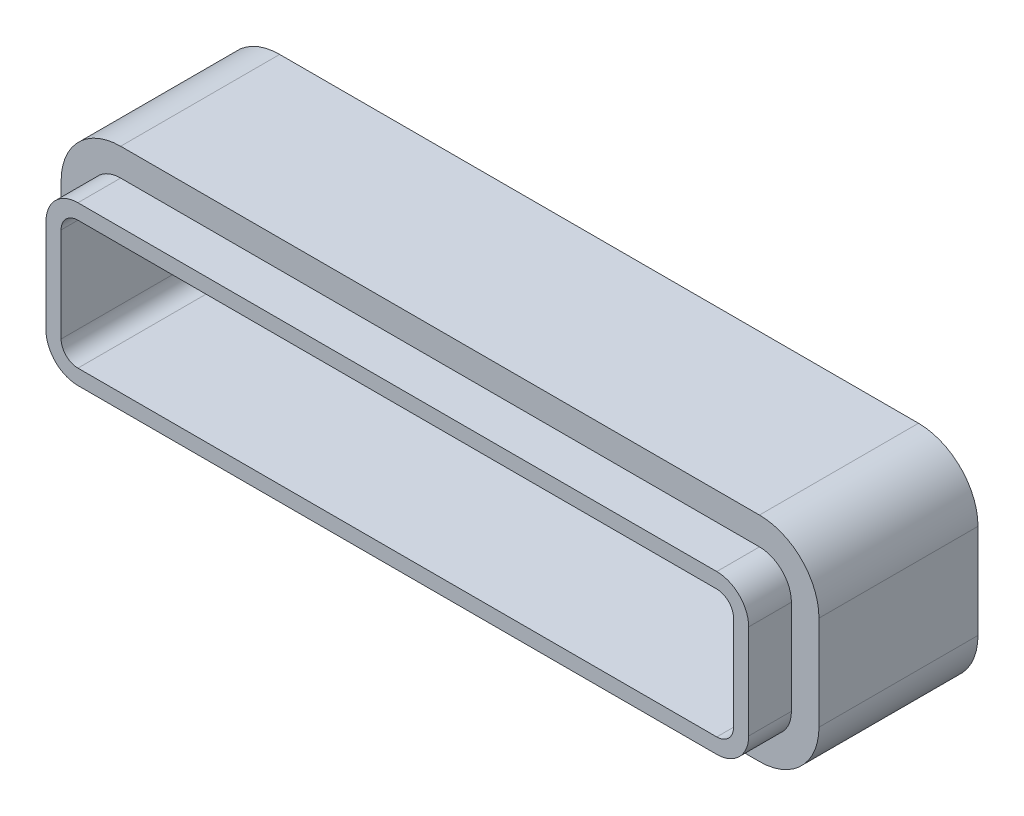
ISO-10303-21;
HEADER;
FILE_DESCRIPTION(('STEP AP214'),'2;1');
FILE_NAME('part.step','',(''),(''),'','','');
FILE_SCHEMA(('AUTOMOTIVE_DESIGN { 1 0 10303 214 1 1 1 1 }'));
ENDSEC;
DATA;
#1=APPLICATION_CONTEXT('core data for automotive mechanical design processes');
#2=APPLICATION_PROTOCOL_DEFINITION('international standard','automotive_design',2000,#1);
#3=PRODUCT_CONTEXT('',#1,'mechanical');
#4=PRODUCT('Part','Part','',(#3));
#5=PRODUCT_RELATED_PRODUCT_CATEGORY('part','',(#4));
#6=PRODUCT_DEFINITION_FORMATION('','',#4);
#7=PRODUCT_DEFINITION_CONTEXT('part definition',#1,'design');
#8=PRODUCT_DEFINITION('design','',#6,#7);
#9=PRODUCT_DEFINITION_SHAPE('','',#8);
#10=(LENGTH_UNIT() NAMED_UNIT(*) SI_UNIT(.MILLI.,.METRE.));
#11=(NAMED_UNIT(*) PLANE_ANGLE_UNIT() SI_UNIT($,.RADIAN.));
#12=(NAMED_UNIT(*) SI_UNIT($,.STERADIAN.) SOLID_ANGLE_UNIT());
#13=UNCERTAINTY_MEASURE_WITH_UNIT(LENGTH_MEASURE(1.E-05),#10,'distance_accuracy_value','');
#14=(GEOMETRIC_REPRESENTATION_CONTEXT(3) GLOBAL_UNCERTAINTY_ASSIGNED_CONTEXT((#13)) GLOBAL_UNIT_ASSIGNED_CONTEXT((#10,
#11,#12)) REPRESENTATION_CONTEXT('',''));
#15=CARTESIAN_POINT('',(0.,0.,0.));
#16=DIRECTION('',(0.,0.,1.));
#17=DIRECTION('',(1.,0.,0.));
#18=AXIS2_PLACEMENT_3D('',#15,#16,#17);
#19=CARTESIAN_POINT('',(95.,14.05,47.3));
#20=DIRECTION('',(0.,0.,-1.));
#21=DIRECTION('',(-1.,0.,0.));
#22=AXIS2_PLACEMENT_3D('',#19,#20,#21);
#23=PLANE('',#22);
#24=CARTESIAN_POINT('',(95.,14.05,47.3));
#25=DIRECTION('',(0.,0.,1.));
#26=DIRECTION('',(-1.,0.,0.));
#27=AXIS2_PLACEMENT_3D('',#24,#25,#26);
#28=CIRCLE('',#27,17.7);
#29=CARTESIAN_POINT('',(112.7,14.0499999999999,47.3));
#30=VERTEX_POINT('',#29);
#31=CARTESIAN_POINT('',(94.9999999999999,31.75,47.3));
#32=VERTEX_POINT('',#31);
#33=EDGE_CURVE('E332',#30,#32,#28,.T.);
#34=ORIENTED_EDGE('',*,*,#33,.T.);
#35=DIRECTION('',(-1.,0.,0.));
#36=VECTOR('',#35,1.);
#37=CARTESIAN_POINT('',(-94.9999999999999,31.75,47.3));
#38=LINE('',#37,#36);
#39=CARTESIAN_POINT('',(-94.9999999999999,31.75,47.3));
#40=VERTEX_POINT('',#39);
#41=EDGE_CURVE('E335',#32,#40,#38,.T.);
#42=ORIENTED_EDGE('',*,*,#41,.T.);
#43=CARTESIAN_POINT('',(-95.,14.05,47.3));
#44=DIRECTION('',(0.,0.,1.));
#45=DIRECTION('',(-1.,0.,0.));
#46=AXIS2_PLACEMENT_3D('',#43,#44,#45);
#47=CIRCLE('',#46,17.7);
#48=CARTESIAN_POINT('',(-112.7,14.0499999999999,47.3));
#49=VERTEX_POINT('',#48);
#50=EDGE_CURVE('E338',#40,#49,#47,.T.);
#51=ORIENTED_EDGE('',*,*,#50,.T.);
#52=DIRECTION('',(0.,-1.,0.));
#53=VECTOR('',#52,1.);
#54=CARTESIAN_POINT('',(-112.7,-14.0499999999999,47.3));
#55=LINE('',#54,#53);
#56=CARTESIAN_POINT('',(-112.7,-14.0499999999999,47.3));
#57=VERTEX_POINT('',#56);
#58=EDGE_CURVE('E340',#49,#57,#55,.T.);
#59=ORIENTED_EDGE('',*,*,#58,.T.);
#60=CARTESIAN_POINT('',(-95.,-14.05,47.3));
#61=DIRECTION('',(0.,0.,1.));
#62=DIRECTION('',(-1.,0.,0.));
#63=AXIS2_PLACEMENT_3D('',#60,#61,#62);
#64=CIRCLE('',#63,17.7);
#65=CARTESIAN_POINT('',(-94.9999999999999,-31.75,47.3));
#66=VERTEX_POINT('',#65);
#67=EDGE_CURVE('E342',#57,#66,#64,.T.);
#68=ORIENTED_EDGE('',*,*,#67,.T.);
#69=DIRECTION('',(1.,0.,0.));
#70=VECTOR('',#69,1.);
#71=CARTESIAN_POINT('',(-94.9999999999999,-31.75,47.3));
#72=LINE('',#71,#70);
#73=CARTESIAN_POINT('',(94.9999999999999,-31.75,47.3));
#74=VERTEX_POINT('',#73);
#75=EDGE_CURVE('E344',#66,#74,#72,.T.);
#76=ORIENTED_EDGE('',*,*,#75,.T.);
#77=CARTESIAN_POINT('',(95.,-14.05,47.3));
#78=DIRECTION('',(0.,0.,1.));
#79=DIRECTION('',(1.,0.,0.));
#80=AXIS2_PLACEMENT_3D('',#77,#78,#79);
#81=CIRCLE('',#80,17.7);
#82=CARTESIAN_POINT('',(112.7,-14.05,47.3));
#83=VERTEX_POINT('',#82);
#84=EDGE_CURVE('E346',#74,#83,#81,.T.);
#85=ORIENTED_EDGE('',*,*,#84,.T.);
#86=DIRECTION('',(0.,1.,0.));
#87=VECTOR('',#86,1.);
#88=CARTESIAN_POINT('',(112.7,-14.0499999999999,47.3));
#89=LINE('',#88,#87);
#90=EDGE_CURVE('E348',#83,#30,#89,.T.);
#91=ORIENTED_EDGE('',*,*,#90,.T.);
#92=EDGE_LOOP('',(#34,#42,#51,#59,#68,#76,#85,#91));
#93=FACE_BOUND('',#92,.T.);
#94=CARTESIAN_POINT('',(-94.9999999999999,14.05,47.3));
#95=DIRECTION('',(0.,0.,1.));
#96=DIRECTION('',(1.,0.,0.));
#97=AXIS2_PLACEMENT_3D('',#94,#95,#96);
#98=CIRCLE('',#97,9.50000000000001);
#99=CARTESIAN_POINT('',(-94.9999999999999,23.55,47.3));
#100=VERTEX_POINT('',#99);
#101=CARTESIAN_POINT('',(-104.5,14.05,47.3));
#102=VERTEX_POINT('',#101);
#103=EDGE_CURVE('E239',#100,#102,#98,.T.);
#104=ORIENTED_EDGE('',*,*,#103,.F.);
#105=DIRECTION('',(-1.,0.,0.));
#106=VECTOR('',#105,1.);
#107=CARTESIAN_POINT('',(95.,23.55,47.3));
#108=LINE('',#107,#106);
#109=CARTESIAN_POINT('',(95.,23.55,47.3));
#110=VERTEX_POINT('',#109);
#111=EDGE_CURVE('E244',#110,#100,#108,.T.);
#112=ORIENTED_EDGE('',*,*,#111,.F.);
#113=CARTESIAN_POINT('',(95.0000000000001,14.05,47.3));
#114=DIRECTION('',(0.,0.,1.));
#115=DIRECTION('',(1.,0.,0.));
#116=AXIS2_PLACEMENT_3D('',#113,#114,#115);
#117=CIRCLE('',#116,9.50000000000001);
#118=CARTESIAN_POINT('',(104.5,14.05,47.3));
#119=VERTEX_POINT('',#118);
#120=EDGE_CURVE('E272',#119,#110,#117,.T.);
#121=ORIENTED_EDGE('',*,*,#120,.F.);
#122=DIRECTION('',(0.,1.,0.));
#123=VECTOR('',#122,1.);
#124=CARTESIAN_POINT('',(104.5,-14.05,47.3));
#125=LINE('',#124,#123);
#126=CARTESIAN_POINT('',(104.5,-14.05,47.3));
#127=VERTEX_POINT('',#126);
#128=EDGE_CURVE('E269',#127,#119,#125,.T.);
#129=ORIENTED_EDGE('',*,*,#128,.F.);
#130=CARTESIAN_POINT('',(95.0000000000001,-14.05,47.3));
#131=DIRECTION('',(0.,0.,1.));
#132=DIRECTION('',(1.,0.,0.));
#133=AXIS2_PLACEMENT_3D('',#130,#131,#132);
#134=CIRCLE('',#133,9.50000000000001);
#135=CARTESIAN_POINT('',(95.,-23.55,47.3));
#136=VERTEX_POINT('',#135);
#137=EDGE_CURVE('E266',#136,#127,#134,.T.);
#138=ORIENTED_EDGE('',*,*,#137,.F.);
#139=DIRECTION('',(1.,0.,0.));
#140=VECTOR('',#139,1.);
#141=CARTESIAN_POINT('',(-94.9999999999999,-23.55,47.3));
#142=LINE('',#141,#140);
#143=CARTESIAN_POINT('',(-94.9999999999999,-23.55,47.3));
#144=VERTEX_POINT('',#143);
#145=EDGE_CURVE('E263',#144,#136,#142,.T.);
#146=ORIENTED_EDGE('',*,*,#145,.F.);
#147=CARTESIAN_POINT('',(-94.9999999999999,-14.05,47.3));
#148=DIRECTION('',(0.,0.,1.));
#149=DIRECTION('',(1.,0.,0.));
#150=AXIS2_PLACEMENT_3D('',#147,#148,#149);
#151=CIRCLE('',#150,9.50000000000001);
#152=CARTESIAN_POINT('',(-104.5,-14.05,47.3));
#153=VERTEX_POINT('',#152);
#154=EDGE_CURVE('E57',#153,#144,#151,.T.);
#155=ORIENTED_EDGE('',*,*,#154,.F.);
#156=DIRECTION('',(0.,-1.,0.));
#157=VECTOR('',#156,1.);
#158=CARTESIAN_POINT('',(-104.5,14.05,47.3));
#159=LINE('',#158,#157);
#160=EDGE_CURVE('E52',#102,#153,#159,.T.);
#161=ORIENTED_EDGE('',*,*,#160,.F.);
#162=EDGE_LOOP('',(#104,#112,#121,#129,#138,#146,#155,#161));
#163=FACE_BOUND('',#162,.T.);
#164=ADVANCED_FACE('F37',(#93,#163),#23,.F.);
#165=CARTESIAN_POINT('',(95.,14.05,0.));
#166=DIRECTION('',(0.,0.,-1.));
#167=DIRECTION('',(-1.,0.,0.));
#168=AXIS2_PLACEMENT_3D('',#165,#166,#167);
#169=PLANE('',#168);
#170=CARTESIAN_POINT('',(95.,14.05,0.));
#171=DIRECTION('',(0.,0.,1.));
#172=DIRECTION('',(-1.,0.,0.));
#173=AXIS2_PLACEMENT_3D('',#170,#171,#172);
#174=CIRCLE('',#173,17.7);
#175=CARTESIAN_POINT('',(112.7,14.0499999999999,0.));
#176=VERTEX_POINT('',#175);
#177=CARTESIAN_POINT('',(94.9999999999999,31.75,0.));
#178=VERTEX_POINT('',#177);
#179=EDGE_CURVE('E206',#176,#178,#174,.T.);
#180=ORIENTED_EDGE('',*,*,#179,.F.);
#181=DIRECTION('',(0.,1.,0.));
#182=VECTOR('',#181,1.);
#183=CARTESIAN_POINT('',(112.7,-14.0499999999999,0.));
#184=LINE('',#183,#182);
#185=CARTESIAN_POINT('',(112.7,-14.05,0.));
#186=VERTEX_POINT('',#185);
#187=EDGE_CURVE('E336',#186,#176,#184,.T.);
#188=ORIENTED_EDGE('',*,*,#187,.F.);
#189=CARTESIAN_POINT('',(95.,-14.05,0.));
#190=DIRECTION('',(0.,0.,1.));
#191=DIRECTION('',(1.,0.,0.));
#192=AXIS2_PLACEMENT_3D('',#189,#190,#191);
#193=CIRCLE('',#192,17.7);
#194=CARTESIAN_POINT('',(94.9999999999999,-31.75,0.));
#195=VERTEX_POINT('',#194);
#196=EDGE_CURVE('E363',#195,#186,#193,.T.);
#197=ORIENTED_EDGE('',*,*,#196,.F.);
#198=DIRECTION('',(1.,0.,0.));
#199=VECTOR('',#198,1.);
#200=CARTESIAN_POINT('',(-94.9999999999999,-31.75,0.));
#201=LINE('',#200,#199);
#202=CARTESIAN_POINT('',(-94.9999999999999,-31.75,0.));
#203=VERTEX_POINT('',#202);
#204=EDGE_CURVE('E361',#203,#195,#201,.T.);
#205=ORIENTED_EDGE('',*,*,#204,.F.);
#206=CARTESIAN_POINT('',(-95.,-14.05,0.));
#207=DIRECTION('',(0.,0.,1.));
#208=DIRECTION('',(-1.,0.,0.));
#209=AXIS2_PLACEMENT_3D('',#206,#207,#208);
#210=CIRCLE('',#209,17.7);
#211=CARTESIAN_POINT('',(-112.7,-14.0499999999999,0.));
#212=VERTEX_POINT('',#211);
#213=EDGE_CURVE('E359',#212,#203,#210,.T.);
#214=ORIENTED_EDGE('',*,*,#213,.F.);
#215=DIRECTION('',(0.,-1.,0.));
#216=VECTOR('',#215,1.);
#217=CARTESIAN_POINT('',(-112.7,-14.0499999999999,0.));
#218=LINE('',#217,#216);
#219=CARTESIAN_POINT('',(-112.7,14.0499999999999,0.));
#220=VERTEX_POINT('',#219);
#221=EDGE_CURVE('E357',#220,#212,#218,.T.);
#222=ORIENTED_EDGE('',*,*,#221,.F.);
#223=CARTESIAN_POINT('',(-95.,14.05,0.));
#224=DIRECTION('',(0.,0.,1.));
#225=DIRECTION('',(-1.,0.,0.));
#226=AXIS2_PLACEMENT_3D('',#223,#224,#225);
#227=CIRCLE('',#226,17.7);
#228=CARTESIAN_POINT('',(-94.9999999999999,31.75,0.));
#229=VERTEX_POINT('',#228);
#230=EDGE_CURVE('E355',#229,#220,#227,.T.);
#231=ORIENTED_EDGE('',*,*,#230,.F.);
#232=DIRECTION('',(-1.,0.,0.));
#233=VECTOR('',#232,1.);
#234=CARTESIAN_POINT('',(-94.9999999999999,31.75,0.));
#235=LINE('',#234,#233);
#236=EDGE_CURVE('E353',#178,#229,#235,.T.);
#237=ORIENTED_EDGE('',*,*,#236,.F.);
#238=EDGE_LOOP('',(#180,#188,#197,#205,#214,#222,#231,#237));
#239=FACE_BOUND('',#238,.T.);
#240=DIRECTION('',(0.,1.,0.));
#241=VECTOR('',#240,1.);
#242=CARTESIAN_POINT('',(100.,-14.05,0.));
#243=LINE('',#242,#241);
#244=CARTESIAN_POINT('',(100.,-14.05,0.));
#245=VERTEX_POINT('',#244);
#246=CARTESIAN_POINT('',(100.,14.05,0.));
#247=VERTEX_POINT('',#246);
#248=EDGE_CURVE('E317',#245,#247,#243,.T.);
#249=ORIENTED_EDGE('',*,*,#248,.T.);
#250=CARTESIAN_POINT('',(95.0000000000001,14.05,0.));
#251=DIRECTION('',(0.,0.,1.));
#252=DIRECTION('',(-1.,0.,0.));
#253=AXIS2_PLACEMENT_3D('',#250,#251,#252);
#254=CIRCLE('',#253,5.);
#255=CARTESIAN_POINT('',(95.,19.05,0.));
#256=VERTEX_POINT('',#255);
#257=EDGE_CURVE('E299',#247,#256,#254,.T.);
#258=ORIENTED_EDGE('',*,*,#257,.T.);
#259=DIRECTION('',(-1.,0.,0.));
#260=VECTOR('',#259,1.);
#261=CARTESIAN_POINT('',(-94.9999999999999,19.05,0.));
#262=LINE('',#261,#260);
#263=CARTESIAN_POINT('',(-94.9999999999999,19.05,0.));
#264=VERTEX_POINT('',#263);
#265=EDGE_CURVE('E203',#256,#264,#262,.T.);
#266=ORIENTED_EDGE('',*,*,#265,.T.);
#267=CARTESIAN_POINT('',(-94.9999999999999,14.05,0.));
#268=DIRECTION('',(0.,0.,1.));
#269=DIRECTION('',(-1.,0.,0.));
#270=AXIS2_PLACEMENT_3D('',#267,#268,#269);
#271=CIRCLE('',#270,5.);
#272=CARTESIAN_POINT('',(-99.9999999999999,14.05,0.));
#273=VERTEX_POINT('',#272);
#274=EDGE_CURVE('E302',#264,#273,#271,.T.);
#275=ORIENTED_EDGE('',*,*,#274,.T.);
#276=DIRECTION('',(0.,-1.,0.));
#277=VECTOR('',#276,1.);
#278=CARTESIAN_POINT('',(-99.9999999999999,-14.05,0.));
#279=LINE('',#278,#277);
#280=CARTESIAN_POINT('',(-99.9999999999999,-14.05,0.));
#281=VERTEX_POINT('',#280);
#282=EDGE_CURVE('E305',#273,#281,#279,.T.);
#283=ORIENTED_EDGE('',*,*,#282,.T.);
#284=CARTESIAN_POINT('',(-94.9999999999999,-14.05,0.));
#285=DIRECTION('',(0.,0.,1.));
#286=DIRECTION('',(-1.,0.,0.));
#287=AXIS2_PLACEMENT_3D('',#284,#285,#286);
#288=CIRCLE('',#287,5.);
#289=CARTESIAN_POINT('',(-94.9999999999999,-19.05,0.));
#290=VERTEX_POINT('',#289);
#291=EDGE_CURVE('E308',#281,#290,#288,.T.);
#292=ORIENTED_EDGE('',*,*,#291,.T.);
#293=DIRECTION('',(1.,0.,0.));
#294=VECTOR('',#293,1.);
#295=CARTESIAN_POINT('',(-94.9999999999999,-19.05,0.));
#296=LINE('',#295,#294);
#297=CARTESIAN_POINT('',(95.,-19.05,0.));
#298=VERTEX_POINT('',#297);
#299=EDGE_CURVE('E311',#290,#298,#296,.T.);
#300=ORIENTED_EDGE('',*,*,#299,.T.);
#301=CARTESIAN_POINT('',(95.0000000000001,-14.05,0.));
#302=DIRECTION('',(0.,0.,1.));
#303=DIRECTION('',(1.,0.,0.));
#304=AXIS2_PLACEMENT_3D('',#301,#302,#303);
#305=CIRCLE('',#304,5.);
#306=EDGE_CURVE('E314',#298,#245,#305,.T.);
#307=ORIENTED_EDGE('',*,*,#306,.T.);
#308=EDGE_LOOP('',(#249,#258,#266,#275,#283,#292,#300,#307));
#309=FACE_BOUND('',#308,.T.);
#310=ADVANCED_FACE('F393',(#239,#309),#169,.T.);
#311=CARTESIAN_POINT('',(95.,14.05,47.3));
#312=DIRECTION('',(0.,0.,-1.));
#313=DIRECTION('',(-1.,0.,0.));
#314=AXIS2_PLACEMENT_3D('',#311,#312,#313);
#315=CYLINDRICAL_SURFACE('',#314,17.7);
#316=ORIENTED_EDGE('',*,*,#179,.T.);
#317=DIRECTION('',(0.,0.,-1.));
#318=VECTOR('',#317,1.);
#319=CARTESIAN_POINT('',(94.9999999999999,31.75,47.3));
#320=LINE('',#319,#318);
#321=EDGE_CURVE('E11',#32,#178,#320,.T.);
#322=ORIENTED_EDGE('',*,*,#321,.F.);
#323=ORIENTED_EDGE('',*,*,#33,.F.);
#324=DIRECTION('',(0.,0.,-1.));
#325=VECTOR('',#324,1.);
#326=CARTESIAN_POINT('',(112.7,14.0499999999999,47.3));
#327=LINE('',#326,#325);
#328=EDGE_CURVE('E350',#30,#176,#327,.T.);
#329=ORIENTED_EDGE('',*,*,#328,.T.);
#330=EDGE_LOOP('',(#316,#322,#323,#329));
#331=FACE_BOUND('',#330,.T.);
#332=ADVANCED_FACE('F39',(#331),#315,.T.);
#333=CARTESIAN_POINT('',(-94.9999999999999,31.75,47.3));
#334=DIRECTION('',(0.,-1.,0.));
#335=DIRECTION('',(0.,0.,-1.));
#336=AXIS2_PLACEMENT_3D('',#333,#334,#335);
#337=PLANE('',#336);
#338=ORIENTED_EDGE('',*,*,#236,.T.);
#339=DIRECTION('',(0.,0.,-1.));
#340=VECTOR('',#339,1.);
#341=CARTESIAN_POINT('',(-94.9999999999999,31.75,47.3));
#342=LINE('',#341,#340);
#343=EDGE_CURVE('E45',#40,#229,#342,.T.);
#344=ORIENTED_EDGE('',*,*,#343,.F.);
#345=ORIENTED_EDGE('',*,*,#41,.F.);
#346=ORIENTED_EDGE('',*,*,#321,.T.);
#347=EDGE_LOOP('',(#338,#344,#345,#346));
#348=FACE_BOUND('',#347,.T.);
#349=ADVANCED_FACE('F410',(#348),#337,.F.);
#350=CARTESIAN_POINT('',(-95.,14.05,47.3));
#351=DIRECTION('',(0.,0.,-1.));
#352=DIRECTION('',(-1.,0.,0.));
#353=AXIS2_PLACEMENT_3D('',#350,#351,#352);
#354=CYLINDRICAL_SURFACE('',#353,17.7);
#355=ORIENTED_EDGE('',*,*,#230,.T.);
#356=DIRECTION('',(0.,0.,-1.));
#357=VECTOR('',#356,1.);
#358=CARTESIAN_POINT('',(-112.7,14.0499999999999,47.3));
#359=LINE('',#358,#357);
#360=EDGE_CURVE('E380',#49,#220,#359,.T.);
#361=ORIENTED_EDGE('',*,*,#360,.F.);
#362=ORIENTED_EDGE('',*,*,#50,.F.);
#363=ORIENTED_EDGE('',*,*,#343,.T.);
#364=EDGE_LOOP('',(#355,#361,#362,#363));
#365=FACE_BOUND('',#364,.T.);
#366=ADVANCED_FACE('F387',(#365),#354,.T.);
#367=CARTESIAN_POINT('',(-112.7,-14.0499999999999,47.3));
#368=DIRECTION('',(1.,0.,0.));
#369=DIRECTION('',(0.,0.,-1.));
#370=AXIS2_PLACEMENT_3D('',#367,#368,#369);
#371=PLANE('',#370);
#372=ORIENTED_EDGE('',*,*,#221,.T.);
#373=DIRECTION('',(0.,0.,-1.));
#374=VECTOR('',#373,1.);
#375=CARTESIAN_POINT('',(-112.7,-14.0499999999999,47.3));
#376=LINE('',#375,#374);
#377=EDGE_CURVE('E377',#57,#212,#376,.T.);
#378=ORIENTED_EDGE('',*,*,#377,.F.);
#379=ORIENTED_EDGE('',*,*,#58,.F.);
#380=ORIENTED_EDGE('',*,*,#360,.T.);
#381=EDGE_LOOP('',(#372,#378,#379,#380));
#382=FACE_BOUND('',#381,.T.);
#383=ADVANCED_FACE('F399',(#382),#371,.F.);
#384=CARTESIAN_POINT('',(-95.,-14.05,47.3));
#385=DIRECTION('',(0.,0.,-1.));
#386=DIRECTION('',(-1.,0.,0.));
#387=AXIS2_PLACEMENT_3D('',#384,#385,#386);
#388=CYLINDRICAL_SURFACE('',#387,17.7);
#389=ORIENTED_EDGE('',*,*,#213,.T.);
#390=DIRECTION('',(0.,0.,-1.));
#391=VECTOR('',#390,1.);
#392=CARTESIAN_POINT('',(-94.9999999999999,-31.75,47.3));
#393=LINE('',#392,#391);
#394=EDGE_CURVE('E374',#66,#203,#393,.T.);
#395=ORIENTED_EDGE('',*,*,#394,.F.);
#396=ORIENTED_EDGE('',*,*,#67,.F.);
#397=ORIENTED_EDGE('',*,*,#377,.T.);
#398=EDGE_LOOP('',(#389,#395,#396,#397));
#399=FACE_BOUND('',#398,.T.);
#400=ADVANCED_FACE('F403',(#399),#388,.T.);
#401=CARTESIAN_POINT('',(-94.9999999999999,-31.75,47.3));
#402=DIRECTION('',(0.,1.,0.));
#403=DIRECTION('',(0.,0.,1.));
#404=AXIS2_PLACEMENT_3D('',#401,#402,#403);
#405=PLANE('',#404);
#406=ORIENTED_EDGE('',*,*,#204,.T.);
#407=DIRECTION('',(0.,0.,-1.));
#408=VECTOR('',#407,1.);
#409=CARTESIAN_POINT('',(94.9999999999999,-31.75,47.3));
#410=LINE('',#409,#408);
#411=EDGE_CURVE('E371',#74,#195,#410,.T.);
#412=ORIENTED_EDGE('',*,*,#411,.F.);
#413=ORIENTED_EDGE('',*,*,#75,.F.);
#414=ORIENTED_EDGE('',*,*,#394,.T.);
#415=EDGE_LOOP('',(#406,#412,#413,#414));
#416=FACE_BOUND('',#415,.T.);
#417=ADVANCED_FACE('F423',(#416),#405,.F.);
#418=CARTESIAN_POINT('',(95.,-14.05,47.3));
#419=DIRECTION('',(0.,0.,-1.));
#420=DIRECTION('',(-1.,0.,0.));
#421=AXIS2_PLACEMENT_3D('',#418,#419,#420);
#422=CYLINDRICAL_SURFACE('',#421,17.7);
#423=ORIENTED_EDGE('',*,*,#196,.T.);
#424=DIRECTION('',(0.,0.,-1.));
#425=VECTOR('',#424,1.);
#426=CARTESIAN_POINT('',(112.7,-14.05,47.3));
#427=LINE('',#426,#425);
#428=EDGE_CURVE('E368',#83,#186,#427,.T.);
#429=ORIENTED_EDGE('',*,*,#428,.F.);
#430=ORIENTED_EDGE('',*,*,#84,.F.);
#431=ORIENTED_EDGE('',*,*,#411,.T.);
#432=EDGE_LOOP('',(#423,#429,#430,#431));
#433=FACE_BOUND('',#432,.T.);
#434=ADVANCED_FACE('F421',(#433),#422,.T.);
#435=CARTESIAN_POINT('',(112.7,-14.0499999999999,47.3));
#436=DIRECTION('',(-1.,0.,0.));
#437=DIRECTION('',(0.,0.,1.));
#438=AXIS2_PLACEMENT_3D('',#435,#436,#437);
#439=PLANE('',#438);
#440=ORIENTED_EDGE('',*,*,#187,.T.);
#441=ORIENTED_EDGE('',*,*,#328,.F.);
#442=ORIENTED_EDGE('',*,*,#90,.F.);
#443=ORIENTED_EDGE('',*,*,#428,.T.);
#444=EDGE_LOOP('',(#440,#441,#442,#443));
#445=FACE_BOUND('',#444,.T.);
#446=ADVANCED_FACE('F416',(#445),#439,.F.);
#447=CARTESIAN_POINT('',(95.0000000000001,14.05,47.3));
#448=DIRECTION('',(0.,0.,-1.));
#449=DIRECTION('',(-1.,0.,0.));
#450=AXIS2_PLACEMENT_3D('',#447,#448,#449);
#451=CYLINDRICAL_SURFACE('',#450,5.);
#452=ORIENTED_EDGE('',*,*,#257,.F.);
#453=DIRECTION('',(0.,0.,-1.));
#454=VECTOR('',#453,1.);
#455=CARTESIAN_POINT('',(100.,14.05,47.3));
#456=LINE('',#455,#454);
#457=CARTESIAN_POINT('',(100.,14.05,60.));
#458=VERTEX_POINT('',#457);
#459=EDGE_CURVE('E213',#458,#247,#456,.T.);
#460=ORIENTED_EDGE('',*,*,#459,.F.);
#461=CARTESIAN_POINT('',(95.0000000000001,14.05,60.));
#462=DIRECTION('',(0.,0.,1.));
#463=DIRECTION('',(1.,0.,0.));
#464=AXIS2_PLACEMENT_3D('',#461,#462,#463);
#465=CIRCLE('',#464,5.);
#466=CARTESIAN_POINT('',(95.,19.05,60.));
#467=VERTEX_POINT('',#466);
#468=EDGE_CURVE('E210',#458,#467,#465,.T.);
#469=ORIENTED_EDGE('',*,*,#468,.T.);
#470=DIRECTION('',(0.,0.,-1.));
#471=VECTOR('',#470,1.);
#472=CARTESIAN_POINT('',(95.,19.05,47.3));
#473=LINE('',#472,#471);
#474=EDGE_CURVE('E196',#467,#256,#473,.T.);
#475=ORIENTED_EDGE('',*,*,#474,.T.);
#476=EDGE_LOOP('',(#452,#460,#469,#475));
#477=FACE_BOUND('',#476,.T.);
#478=ADVANCED_FACE('F211',(#477),#451,.F.);
#479=CARTESIAN_POINT('',(-94.9999999999999,19.05,47.3));
#480=DIRECTION('',(0.,-1.,0.));
#481=DIRECTION('',(0.,0.,-1.));
#482=AXIS2_PLACEMENT_3D('',#479,#480,#481);
#483=PLANE('',#482);
#484=ORIENTED_EDGE('',*,*,#265,.F.);
#485=ORIENTED_EDGE('',*,*,#474,.F.);
#486=DIRECTION('',(-1.,0.,0.));
#487=VECTOR('',#486,1.);
#488=CARTESIAN_POINT('',(95.,19.05,60.));
#489=LINE('',#488,#487);
#490=CARTESIAN_POINT('',(-94.9999999999999,19.05,60.));
#491=VERTEX_POINT('',#490);
#492=EDGE_CURVE('E200',#467,#491,#489,.T.);
#493=ORIENTED_EDGE('',*,*,#492,.T.);
#494=DIRECTION('',(0.,0.,-1.));
#495=VECTOR('',#494,1.);
#496=CARTESIAN_POINT('',(-94.9999999999999,19.05,47.3));
#497=LINE('',#496,#495);
#498=EDGE_CURVE('E207',#491,#264,#497,.T.);
#499=ORIENTED_EDGE('',*,*,#498,.T.);
#500=EDGE_LOOP('',(#484,#485,#493,#499));
#501=FACE_BOUND('',#500,.T.);
#502=ADVANCED_FACE('F198',(#501),#483,.T.);
#503=CARTESIAN_POINT('',(-94.9999999999999,14.05,47.3));
#504=DIRECTION('',(0.,0.,-1.));
#505=DIRECTION('',(-1.,0.,0.));
#506=AXIS2_PLACEMENT_3D('',#503,#504,#505);
#507=CYLINDRICAL_SURFACE('',#506,5.);
#508=ORIENTED_EDGE('',*,*,#274,.F.);
#509=ORIENTED_EDGE('',*,*,#498,.F.);
#510=CARTESIAN_POINT('',(-94.9999999999999,14.05,60.));
#511=DIRECTION('',(0.,0.,1.));
#512=DIRECTION('',(1.,0.,0.));
#513=AXIS2_PLACEMENT_3D('',#510,#511,#512);
#514=CIRCLE('',#513,5.);
#515=CARTESIAN_POINT('',(-99.9999999999999,14.05,60.));
#516=VERTEX_POINT('',#515);
#517=EDGE_CURVE('E221',#491,#516,#514,.T.);
#518=ORIENTED_EDGE('',*,*,#517,.T.);
#519=DIRECTION('',(0.,0.,-1.));
#520=VECTOR('',#519,1.);
#521=CARTESIAN_POINT('',(-99.9999999999999,14.05,47.3));
#522=LINE('',#521,#520);
#523=EDGE_CURVE('E329',#516,#273,#522,.T.);
#524=ORIENTED_EDGE('',*,*,#523,.T.);
#525=EDGE_LOOP('',(#508,#509,#518,#524));
#526=FACE_BOUND('',#525,.T.);
#527=ADVANCED_FACE('F448',(#526),#507,.F.);
#528=CARTESIAN_POINT('',(-99.9999999999999,-14.05,47.3));
#529=DIRECTION('',(1.,0.,0.));
#530=DIRECTION('',(0.,0.,-1.));
#531=AXIS2_PLACEMENT_3D('',#528,#529,#530);
#532=PLANE('',#531);
#533=ORIENTED_EDGE('',*,*,#282,.F.);
#534=ORIENTED_EDGE('',*,*,#523,.F.);
#535=DIRECTION('',(0.,-1.,0.));
#536=VECTOR('',#535,1.);
#537=CARTESIAN_POINT('',(-99.9999999999999,14.05,60.));
#538=LINE('',#537,#536);
#539=CARTESIAN_POINT('',(-99.9999999999999,-14.05,60.));
#540=VERTEX_POINT('',#539);
#541=EDGE_CURVE('E223',#516,#540,#538,.T.);
#542=ORIENTED_EDGE('',*,*,#541,.T.);
#543=DIRECTION('',(0.,0.,-1.));
#544=VECTOR('',#543,1.);
#545=CARTESIAN_POINT('',(-99.9999999999999,-14.05,47.3));
#546=LINE('',#545,#544);
#547=EDGE_CURVE('E327',#540,#281,#546,.T.);
#548=ORIENTED_EDGE('',*,*,#547,.T.);
#549=EDGE_LOOP('',(#533,#534,#542,#548));
#550=FACE_BOUND('',#549,.T.);
#551=ADVANCED_FACE('F452',(#550),#532,.T.);
#552=CARTESIAN_POINT('',(-94.9999999999999,-14.05,47.3));
#553=DIRECTION('',(0.,0.,-1.));
#554=DIRECTION('',(-1.,0.,0.));
#555=AXIS2_PLACEMENT_3D('',#552,#553,#554);
#556=CYLINDRICAL_SURFACE('',#555,5.);
#557=ORIENTED_EDGE('',*,*,#291,.F.);
#558=ORIENTED_EDGE('',*,*,#547,.F.);
#559=CARTESIAN_POINT('',(-94.9999999999999,-14.05,60.));
#560=DIRECTION('',(0.,0.,1.));
#561=DIRECTION('',(1.,0.,0.));
#562=AXIS2_PLACEMENT_3D('',#559,#560,#561);
#563=CIRCLE('',#562,5.);
#564=CARTESIAN_POINT('',(-94.9999999999999,-19.05,60.));
#565=VERTEX_POINT('',#564);
#566=EDGE_CURVE('E228',#540,#565,#563,.T.);
#567=ORIENTED_EDGE('',*,*,#566,.T.);
#568=DIRECTION('',(0.,0.,-1.));
#569=VECTOR('',#568,1.);
#570=CARTESIAN_POINT('',(-94.9999999999999,-19.05,47.3));
#571=LINE('',#570,#569);
#572=EDGE_CURVE('E325',#565,#290,#571,.T.);
#573=ORIENTED_EDGE('',*,*,#572,.T.);
#574=EDGE_LOOP('',(#557,#558,#567,#573));
#575=FACE_BOUND('',#574,.T.);
#576=ADVANCED_FACE('F458',(#575),#556,.F.);
#577=CARTESIAN_POINT('',(-94.9999999999999,-19.05,47.3));
#578=DIRECTION('',(0.,1.,0.));
#579=DIRECTION('',(0.,0.,1.));
#580=AXIS2_PLACEMENT_3D('',#577,#578,#579);
#581=PLANE('',#580);
#582=ORIENTED_EDGE('',*,*,#299,.F.);
#583=ORIENTED_EDGE('',*,*,#572,.F.);
#584=DIRECTION('',(1.,0.,0.));
#585=VECTOR('',#584,1.);
#586=CARTESIAN_POINT('',(-94.9999999999999,-19.05,60.));
#587=LINE('',#586,#585);
#588=CARTESIAN_POINT('',(95.,-19.05,60.));
#589=VERTEX_POINT('',#588);
#590=EDGE_CURVE('E231',#565,#589,#587,.T.);
#591=ORIENTED_EDGE('',*,*,#590,.T.);
#592=DIRECTION('',(0.,0.,-1.));
#593=VECTOR('',#592,1.);
#594=CARTESIAN_POINT('',(95.,-19.05,47.3));
#595=LINE('',#594,#593);
#596=EDGE_CURVE('E323',#589,#298,#595,.T.);
#597=ORIENTED_EDGE('',*,*,#596,.T.);
#598=EDGE_LOOP('',(#582,#583,#591,#597));
#599=FACE_BOUND('',#598,.T.);
#600=ADVANCED_FACE('F462',(#599),#581,.T.);
#601=CARTESIAN_POINT('',(95.0000000000001,-14.05,47.3));
#602=DIRECTION('',(0.,0.,-1.));
#603=DIRECTION('',(-1.,0.,0.));
#604=AXIS2_PLACEMENT_3D('',#601,#602,#603);
#605=CYLINDRICAL_SURFACE('',#604,5.);
#606=ORIENTED_EDGE('',*,*,#306,.F.);
#607=ORIENTED_EDGE('',*,*,#596,.F.);
#608=CARTESIAN_POINT('',(95.0000000000001,-14.05,60.));
#609=DIRECTION('',(0.,0.,1.));
#610=DIRECTION('',(1.,0.,0.));
#611=AXIS2_PLACEMENT_3D('',#608,#609,#610);
#612=CIRCLE('',#611,5.);
#613=CARTESIAN_POINT('',(100.,-14.05,60.));
#614=VERTEX_POINT('',#613);
#615=EDGE_CURVE('E234',#589,#614,#612,.T.);
#616=ORIENTED_EDGE('',*,*,#615,.T.);
#617=DIRECTION('',(0.,0.,-1.));
#618=VECTOR('',#617,1.);
#619=CARTESIAN_POINT('',(100.,-14.05,47.3));
#620=LINE('',#619,#618);
#621=EDGE_CURVE('E321',#614,#245,#620,.T.);
#622=ORIENTED_EDGE('',*,*,#621,.T.);
#623=EDGE_LOOP('',(#606,#607,#616,#622));
#624=FACE_BOUND('',#623,.T.);
#625=ADVANCED_FACE('F466',(#624),#605,.F.);
#626=CARTESIAN_POINT('',(100.,-14.05,47.3));
#627=DIRECTION('',(-1.,0.,0.));
#628=DIRECTION('',(0.,0.,1.));
#629=AXIS2_PLACEMENT_3D('',#626,#627,#628);
#630=PLANE('',#629);
#631=ORIENTED_EDGE('',*,*,#248,.F.);
#632=ORIENTED_EDGE('',*,*,#621,.F.);
#633=DIRECTION('',(0.,1.,0.));
#634=VECTOR('',#633,1.);
#635=CARTESIAN_POINT('',(100.,-14.05,60.));
#636=LINE('',#635,#634);
#637=EDGE_CURVE('E237',#614,#458,#636,.T.);
#638=ORIENTED_EDGE('',*,*,#637,.T.);
#639=ORIENTED_EDGE('',*,*,#459,.T.);
#640=EDGE_LOOP('',(#631,#632,#638,#639));
#641=FACE_BOUND('',#640,.T.);
#642=ADVANCED_FACE('F470',(#641),#630,.T.);
#643=CARTESIAN_POINT('',(-94.9999999999999,14.05,60.));
#644=DIRECTION('',(0.,0.,1.));
#645=DIRECTION('',(1.,0.,0.));
#646=AXIS2_PLACEMENT_3D('',#643,#644,#645);
#647=PLANE('',#646);
#648=CARTESIAN_POINT('',(-94.9999999999999,14.05,60.));
#649=DIRECTION('',(0.,0.,1.));
#650=DIRECTION('',(1.,0.,0.));
#651=AXIS2_PLACEMENT_3D('',#648,#649,#650);
#652=CIRCLE('',#651,9.50000000000001);
#653=CARTESIAN_POINT('',(-94.9999999999999,23.55,60.));
#654=VERTEX_POINT('',#653);
#655=CARTESIAN_POINT('',(-104.5,14.05,60.));
#656=VERTEX_POINT('',#655);
#657=EDGE_CURVE('E240',#654,#656,#652,.T.);
#658=ORIENTED_EDGE('',*,*,#657,.T.);
#659=DIRECTION('',(0.,-1.,0.));
#660=VECTOR('',#659,1.);
#661=CARTESIAN_POINT('',(-104.5,14.05,60.));
#662=LINE('',#661,#660);
#663=CARTESIAN_POINT('',(-104.5,-14.05,60.));
#664=VERTEX_POINT('',#663);
#665=EDGE_CURVE('E243',#656,#664,#662,.T.);
#666=ORIENTED_EDGE('',*,*,#665,.T.);
#667=CARTESIAN_POINT('',(-94.9999999999999,-14.05,60.));
#668=DIRECTION('',(0.,0.,1.));
#669=DIRECTION('',(1.,0.,0.));
#670=AXIS2_PLACEMENT_3D('',#667,#668,#669);
#671=CIRCLE('',#670,9.50000000000001);
#672=CARTESIAN_POINT('',(-94.9999999999999,-23.55,60.));
#673=VERTEX_POINT('',#672);
#674=EDGE_CURVE('E246',#664,#673,#671,.T.);
#675=ORIENTED_EDGE('',*,*,#674,.T.);
#676=DIRECTION('',(1.,0.,0.));
#677=VECTOR('',#676,1.);
#678=CARTESIAN_POINT('',(-94.9999999999999,-23.55,60.));
#679=LINE('',#678,#677);
#680=CARTESIAN_POINT('',(95.,-23.55,60.));
#681=VERTEX_POINT('',#680);
#682=EDGE_CURVE('E248',#673,#681,#679,.T.);
#683=ORIENTED_EDGE('',*,*,#682,.T.);
#684=CARTESIAN_POINT('',(95.0000000000001,-14.05,60.));
#685=DIRECTION('',(0.,0.,1.));
#686=DIRECTION('',(1.,0.,0.));
#687=AXIS2_PLACEMENT_3D('',#684,#685,#686);
#688=CIRCLE('',#687,9.50000000000001);
#689=CARTESIAN_POINT('',(104.5,-14.05,60.));
#690=VERTEX_POINT('',#689);
#691=EDGE_CURVE('E250',#681,#690,#688,.T.);
#692=ORIENTED_EDGE('',*,*,#691,.T.);
#693=DIRECTION('',(0.,1.,0.));
#694=VECTOR('',#693,1.);
#695=CARTESIAN_POINT('',(104.5,-14.05,60.));
#696=LINE('',#695,#694);
#697=CARTESIAN_POINT('',(104.5,14.05,60.));
#698=VERTEX_POINT('',#697);
#699=EDGE_CURVE('E252',#690,#698,#696,.T.);
#700=ORIENTED_EDGE('',*,*,#699,.T.);
#701=CARTESIAN_POINT('',(95.0000000000001,14.05,60.));
#702=DIRECTION('',(0.,0.,1.));
#703=DIRECTION('',(1.,0.,0.));
#704=AXIS2_PLACEMENT_3D('',#701,#702,#703);
#705=CIRCLE('',#704,9.50000000000001);
#706=CARTESIAN_POINT('',(95.,23.55,60.));
#707=VERTEX_POINT('',#706);
#708=EDGE_CURVE('E254',#698,#707,#705,.T.);
#709=ORIENTED_EDGE('',*,*,#708,.T.);
#710=DIRECTION('',(-1.,0.,0.));
#711=VECTOR('',#710,1.);
#712=CARTESIAN_POINT('',(95.,23.55,60.));
#713=LINE('',#712,#711);
#714=EDGE_CURVE('E256',#707,#654,#713,.T.);
#715=ORIENTED_EDGE('',*,*,#714,.T.);
#716=EDGE_LOOP('',(#658,#666,#675,#683,#692,#700,#709,#715));
#717=FACE_BOUND('',#716,.T.);
#718=ORIENTED_EDGE('',*,*,#492,.F.);
#719=ORIENTED_EDGE('',*,*,#468,.F.);
#720=ORIENTED_EDGE('',*,*,#637,.F.);
#721=ORIENTED_EDGE('',*,*,#615,.F.);
#722=ORIENTED_EDGE('',*,*,#590,.F.);
#723=ORIENTED_EDGE('',*,*,#566,.F.);
#724=ORIENTED_EDGE('',*,*,#541,.F.);
#725=ORIENTED_EDGE('',*,*,#517,.F.);
#726=EDGE_LOOP('',(#718,#719,#720,#721,#722,#723,#724,#725));
#727=FACE_BOUND('',#726,.T.);
#728=ADVANCED_FACE('F218',(#717,#727),#647,.T.);
#729=CARTESIAN_POINT('',(-94.9999999999999,14.05,60.));
#730=DIRECTION('',(0.,0.,-1.));
#731=DIRECTION('',(-1.,0.,0.));
#732=AXIS2_PLACEMENT_3D('',#729,#730,#731);
#733=CYLINDRICAL_SURFACE('',#732,9.50000000000001);
#734=ORIENTED_EDGE('',*,*,#103,.T.);
#735=DIRECTION('',(0.,0.,-1.));
#736=VECTOR('',#735,1.);
#737=CARTESIAN_POINT('',(-104.5,14.05,60.));
#738=LINE('',#737,#736);
#739=EDGE_CURVE('E297',#656,#102,#738,.T.);
#740=ORIENTED_EDGE('',*,*,#739,.F.);
#741=ORIENTED_EDGE('',*,*,#657,.F.);
#742=DIRECTION('',(0.,0.,-1.));
#743=VECTOR('',#742,1.);
#744=CARTESIAN_POINT('',(-94.9999999999999,23.55,60.));
#745=LINE('',#744,#743);
#746=EDGE_CURVE('E258',#654,#100,#745,.T.);
#747=ORIENTED_EDGE('',*,*,#746,.T.);
#748=EDGE_LOOP('',(#734,#740,#741,#747));
#749=FACE_BOUND('',#748,.T.);
#750=ADVANCED_FACE('F475',(#749),#733,.T.);
#751=CARTESIAN_POINT('',(-104.5,14.05,60.));
#752=DIRECTION('',(1.,0.,0.));
#753=DIRECTION('',(0.,0.,-1.));
#754=AXIS2_PLACEMENT_3D('',#751,#752,#753);
#755=PLANE('',#754);
#756=ORIENTED_EDGE('',*,*,#160,.T.);
#757=DIRECTION('',(0.,0.,-1.));
#758=VECTOR('',#757,1.);
#759=CARTESIAN_POINT('',(-104.5,-14.05,60.));
#760=LINE('',#759,#758);
#761=EDGE_CURVE('E294',#664,#153,#760,.T.);
#762=ORIENTED_EDGE('',*,*,#761,.F.);
#763=ORIENTED_EDGE('',*,*,#665,.F.);
#764=ORIENTED_EDGE('',*,*,#739,.T.);
#765=EDGE_LOOP('',(#756,#762,#763,#764));
#766=FACE_BOUND('',#765,.T.);
#767=ADVANCED_FACE('F478',(#766),#755,.F.);
#768=CARTESIAN_POINT('',(-94.9999999999999,-14.05,60.));
#769=DIRECTION('',(0.,0.,-1.));
#770=DIRECTION('',(-1.,0.,0.));
#771=AXIS2_PLACEMENT_3D('',#768,#769,#770);
#772=CYLINDRICAL_SURFACE('',#771,9.50000000000001);
#773=ORIENTED_EDGE('',*,*,#154,.T.);
#774=DIRECTION('',(0.,0.,-1.));
#775=VECTOR('',#774,1.);
#776=CARTESIAN_POINT('',(-94.9999999999999,-23.55,60.));
#777=LINE('',#776,#775);
#778=EDGE_CURVE('E291',#673,#144,#777,.T.);
#779=ORIENTED_EDGE('',*,*,#778,.F.);
#780=ORIENTED_EDGE('',*,*,#674,.F.);
#781=ORIENTED_EDGE('',*,*,#761,.T.);
#782=EDGE_LOOP('',(#773,#779,#780,#781));
#783=FACE_BOUND('',#782,.T.);
#784=ADVANCED_FACE('F482',(#783),#772,.T.);
#785=CARTESIAN_POINT('',(-94.9999999999999,-23.55,60.));
#786=DIRECTION('',(0.,1.,0.));
#787=DIRECTION('',(0.,0.,1.));
#788=AXIS2_PLACEMENT_3D('',#785,#786,#787);
#789=PLANE('',#788);
#790=ORIENTED_EDGE('',*,*,#145,.T.);
#791=DIRECTION('',(0.,0.,-1.));
#792=VECTOR('',#791,1.);
#793=CARTESIAN_POINT('',(95.,-23.55,60.));
#794=LINE('',#793,#792);
#795=EDGE_CURVE('E288',#681,#136,#794,.T.);
#796=ORIENTED_EDGE('',*,*,#795,.F.);
#797=ORIENTED_EDGE('',*,*,#682,.F.);
#798=ORIENTED_EDGE('',*,*,#778,.T.);
#799=EDGE_LOOP('',(#790,#796,#797,#798));
#800=FACE_BOUND('',#799,.T.);
#801=ADVANCED_FACE('F486',(#800),#789,.F.);
#802=CARTESIAN_POINT('',(95.0000000000001,-14.05,60.));
#803=DIRECTION('',(0.,0.,-1.));
#804=DIRECTION('',(-1.,0.,0.));
#805=AXIS2_PLACEMENT_3D('',#802,#803,#804);
#806=CYLINDRICAL_SURFACE('',#805,9.50000000000001);
#807=ORIENTED_EDGE('',*,*,#137,.T.);
#808=DIRECTION('',(0.,0.,-1.));
#809=VECTOR('',#808,1.);
#810=CARTESIAN_POINT('',(104.5,-14.05,60.));
#811=LINE('',#810,#809);
#812=EDGE_CURVE('E285',#690,#127,#811,.T.);
#813=ORIENTED_EDGE('',*,*,#812,.F.);
#814=ORIENTED_EDGE('',*,*,#691,.F.);
#815=ORIENTED_EDGE('',*,*,#795,.T.);
#816=EDGE_LOOP('',(#807,#813,#814,#815));
#817=FACE_BOUND('',#816,.T.);
#818=ADVANCED_FACE('F490',(#817),#806,.T.);
#819=CARTESIAN_POINT('',(104.5,-14.05,60.));
#820=DIRECTION('',(-1.,0.,0.));
#821=DIRECTION('',(0.,0.,1.));
#822=AXIS2_PLACEMENT_3D('',#819,#820,#821);
#823=PLANE('',#822);
#824=ORIENTED_EDGE('',*,*,#128,.T.);
#825=DIRECTION('',(0.,0.,-1.));
#826=VECTOR('',#825,1.);
#827=CARTESIAN_POINT('',(104.5,14.05,60.));
#828=LINE('',#827,#826);
#829=EDGE_CURVE('E282',#698,#119,#828,.T.);
#830=ORIENTED_EDGE('',*,*,#829,.F.);
#831=ORIENTED_EDGE('',*,*,#699,.F.);
#832=ORIENTED_EDGE('',*,*,#812,.T.);
#833=EDGE_LOOP('',(#824,#830,#831,#832));
#834=FACE_BOUND('',#833,.T.);
#835=ADVANCED_FACE('F494',(#834),#823,.F.);
#836=CARTESIAN_POINT('',(95.0000000000001,14.05,60.));
#837=DIRECTION('',(0.,0.,-1.));
#838=DIRECTION('',(-1.,0.,0.));
#839=AXIS2_PLACEMENT_3D('',#836,#837,#838);
#840=CYLINDRICAL_SURFACE('',#839,9.50000000000001);
#841=ORIENTED_EDGE('',*,*,#120,.T.);
#842=DIRECTION('',(0.,0.,-1.));
#843=VECTOR('',#842,1.);
#844=CARTESIAN_POINT('',(95.,23.55,60.));
#845=LINE('',#844,#843);
#846=EDGE_CURVE('E279',#707,#110,#845,.T.);
#847=ORIENTED_EDGE('',*,*,#846,.F.);
#848=ORIENTED_EDGE('',*,*,#708,.F.);
#849=ORIENTED_EDGE('',*,*,#829,.T.);
#850=EDGE_LOOP('',(#841,#847,#848,#849));
#851=FACE_BOUND('',#850,.T.);
#852=ADVANCED_FACE('F498',(#851),#840,.T.);
#853=CARTESIAN_POINT('',(95.,23.55,60.));
#854=DIRECTION('',(0.,-1.,0.));
#855=DIRECTION('',(0.,0.,-1.));
#856=AXIS2_PLACEMENT_3D('',#853,#854,#855);
#857=PLANE('',#856);
#858=ORIENTED_EDGE('',*,*,#111,.T.);
#859=ORIENTED_EDGE('',*,*,#746,.F.);
#860=ORIENTED_EDGE('',*,*,#714,.F.);
#861=ORIENTED_EDGE('',*,*,#846,.T.);
#862=EDGE_LOOP('',(#858,#859,#860,#861));
#863=FACE_BOUND('',#862,.T.);
#864=ADVANCED_FACE('F502',(#863),#857,.F.);
#865=CLOSED_SHELL('',(#164,#310,#332,#349,#366,#383,#400,#417,#434,#446,#478,#502,#527,#551,
#576,#600,#625,#642,#728,#750,#767,#784,#801,#818,#835,#852,#864));
#866=MANIFOLD_SOLID_BREP('B2',#865);
#867=ADVANCED_BREP_SHAPE_REPRESENTATION('',(#18,#866),#14);
#868=SHAPE_DEFINITION_REPRESENTATION(#9,#867);
ENDSEC;
END-ISO-10303-21;
